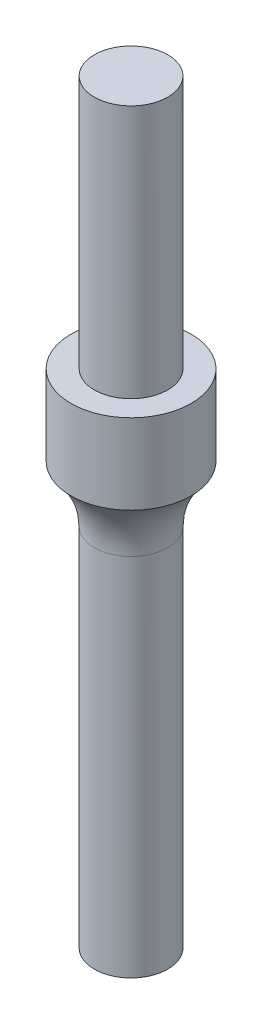
ISO-10303-21;
HEADER;
FILE_DESCRIPTION(('STEP AP214'),'2;1');
FILE_NAME('part.step','',(''),(''),'','','');
FILE_SCHEMA(('AUTOMOTIVE_DESIGN { 1 0 10303 214 1 1 1 1 }'));
ENDSEC;
DATA;
#1=APPLICATION_CONTEXT('core data for automotive mechanical design processes');
#2=APPLICATION_PROTOCOL_DEFINITION('international standard','automotive_design',2000,#1);
#3=PRODUCT_CONTEXT('',#1,'mechanical');
#4=PRODUCT('Part','Part','',(#3));
#5=PRODUCT_RELATED_PRODUCT_CATEGORY('part','',(#4));
#6=PRODUCT_DEFINITION_FORMATION('','',#4);
#7=PRODUCT_DEFINITION_CONTEXT('part definition',#1,'design');
#8=PRODUCT_DEFINITION('design','',#6,#7);
#9=PRODUCT_DEFINITION_SHAPE('','',#8);
#10=(LENGTH_UNIT() NAMED_UNIT(*) SI_UNIT(.MILLI.,.METRE.));
#11=(NAMED_UNIT(*) PLANE_ANGLE_UNIT() SI_UNIT($,.RADIAN.));
#12=(NAMED_UNIT(*) SI_UNIT($,.STERADIAN.) SOLID_ANGLE_UNIT());
#13=UNCERTAINTY_MEASURE_WITH_UNIT(LENGTH_MEASURE(1.E-05),#10,'distance_accuracy_value','');
#14=(GEOMETRIC_REPRESENTATION_CONTEXT(3) GLOBAL_UNCERTAINTY_ASSIGNED_CONTEXT((#13)) GLOBAL_UNIT_ASSIGNED_CONTEXT((#10,
#11,#12)) REPRESENTATION_CONTEXT('',''));
#15=CARTESIAN_POINT('',(0.,0.,0.));
#16=DIRECTION('',(0.,0.,1.));
#17=DIRECTION('',(1.,0.,0.));
#18=AXIS2_PLACEMENT_3D('',#15,#16,#17);
#19=CARTESIAN_POINT('',(39.00000074,-6.09116098,-25.3000002));
#20=DIRECTION('',(0.,1.,0.));
#21=DIRECTION('',(0.,0.,1.));
#22=AXIS2_PLACEMENT_3D('',#19,#20,#21);
#23=PLANE('',#22);
#24=CARTESIAN_POINT('',(39.00000074,-6.09116098,-25.3000002));
#25=DIRECTION('',(0.,-1.,0.));
#26=DIRECTION('',(0.,0.,-1.));
#27=AXIS2_PLACEMENT_3D('',#24,#25,#26);
#28=CIRCLE('',#27,1.375);
#29=CARTESIAN_POINT('',(39.00000074,-6.09116098,-26.6750002));
#30=VERTEX_POINT('',#29);
#31=EDGE_CURVE('E43',#30,#30,#28,.T.);
#32=ORIENTED_EDGE('',*,*,#31,.T.);
#33=EDGE_LOOP('',(#32));
#34=FACE_BOUND('',#33,.T.);
#35=ADVANCED_FACE('F36',(#34),#23,.F.);
#36=CARTESIAN_POINT('',(39.00000074,-6.09116098,-25.3000002));
#37=DIRECTION('',(0.,-1.,0.));
#38=DIRECTION('',(0.,0.,-1.));
#39=AXIS2_PLACEMENT_3D('',#36,#37,#38);
#40=CYLINDRICAL_SURFACE('',#39,1.375);
#41=CARTESIAN_POINT('',(39.00000074,7.58236468673782,-25.3000002));
#42=DIRECTION('',(0.,1.,0.));
#43=DIRECTION('',(0.,0.,1.));
#44=AXIS2_PLACEMENT_3D('',#41,#42,#43);
#45=CIRCLE('',#44,1.375);
#46=CARTESIAN_POINT('',(39.00000074,7.58236468673782,-23.9250002));
#47=VERTEX_POINT('',#46);
#48=EDGE_CURVE('E10',#47,#47,#45,.F.);
#49=ORIENTED_EDGE('',*,*,#48,.T.);
#50=EDGE_LOOP('',(#49));
#51=FACE_BOUND('',#50,.T.);
#52=ORIENTED_EDGE('',*,*,#31,.F.);
#53=EDGE_LOOP('',(#52));
#54=FACE_BOUND('',#53,.T.);
#55=ADVANCED_FACE('F81',(#51,#54),#40,.T.);
#56=CARTESIAN_POINT('',(39.00000074,-6.09116098,-25.3000002));
#57=DIRECTION('',(0.,-1.,0.));
#58=DIRECTION('',(0.,0.,-1.));
#59=AXIS2_PLACEMENT_3D('',#56,#57,#58);
#60=CYLINDRICAL_SURFACE('',#59,2.25);
#61=CARTESIAN_POINT('',(39.00000074,9.69999898,-25.3000002));
#62=DIRECTION('',(0.,-1.,0.));
#63=DIRECTION('',(0.,0.,-1.));
#64=AXIS2_PLACEMENT_3D('',#61,#62,#63);
#65=CIRCLE('',#64,2.25);
#66=CARTESIAN_POINT('',(39.00000074,9.69999898,-27.5500002));
#67=VERTEX_POINT('',#66);
#68=EDGE_CURVE('E47',#67,#67,#65,.T.);
#69=ORIENTED_EDGE('',*,*,#68,.F.);
#70=EDGE_LOOP('',(#69));
#71=FACE_BOUND('',#70,.T.);
#72=CARTESIAN_POINT('',(39.00000074,12.69999898,-25.3000002));
#73=DIRECTION('',(0.,-1.,0.));
#74=DIRECTION('',(0.,0.,-1.));
#75=AXIS2_PLACEMENT_3D('',#72,#73,#74);
#76=CIRCLE('',#75,2.25);
#77=CARTESIAN_POINT('',(39.00000074,12.69999898,-27.5500002));
#78=VERTEX_POINT('',#77);
#79=EDGE_CURVE('E51',#78,#78,#76,.T.);
#80=ORIENTED_EDGE('',*,*,#79,.T.);
#81=EDGE_LOOP('',(#80));
#82=FACE_BOUND('',#81,.T.);
#83=ADVANCED_FACE('F75',(#71,#82),#60,.T.);
#84=CARTESIAN_POINT('',(41.25000074,12.69999898,-25.3000002));
#85=DIRECTION('',(0.,-1.,0.));
#86=DIRECTION('',(0.,0.,-1.));
#87=AXIS2_PLACEMENT_3D('',#84,#85,#86);
#88=PLANE('',#87);
#89=ORIENTED_EDGE('',*,*,#79,.F.);
#90=EDGE_LOOP('',(#89));
#91=FACE_BOUND('',#90,.T.);
#92=CARTESIAN_POINT('',(39.00000074,12.69999898,-25.3000002));
#93=DIRECTION('',(0.,-1.,0.));
#94=DIRECTION('',(0.,0.,-1.));
#95=AXIS2_PLACEMENT_3D('',#92,#93,#94);
#96=CIRCLE('',#95,1.375);
#97=CARTESIAN_POINT('',(39.00000074,12.69999898,-26.6750002));
#98=VERTEX_POINT('',#97);
#99=EDGE_CURVE('E56',#98,#98,#96,.T.);
#100=ORIENTED_EDGE('',*,*,#99,.T.);
#101=EDGE_LOOP('',(#100));
#102=FACE_BOUND('',#101,.T.);
#103=ADVANCED_FACE('F67',(#91,#102),#88,.F.);
#104=CARTESIAN_POINT('',(39.00000074,-6.09116098,-25.3000002));
#105=DIRECTION('',(0.,-1.,0.));
#106=DIRECTION('',(0.,0.,-1.));
#107=AXIS2_PLACEMENT_3D('',#104,#105,#106);
#108=CYLINDRICAL_SURFACE('',#107,1.375);
#109=ORIENTED_EDGE('',*,*,#99,.F.);
#110=EDGE_LOOP('',(#109));
#111=FACE_BOUND('',#110,.T.);
#112=CARTESIAN_POINT('',(39.00000074,22.19999898,-25.3000002));
#113=DIRECTION('',(0.,1.,0.));
#114=DIRECTION('',(0.,0.,1.));
#115=AXIS2_PLACEMENT_3D('',#112,#113,#114);
#116=CIRCLE('',#115,1.375);
#117=CARTESIAN_POINT('',(39.00000074,22.19999898,-23.9250002));
#118=VERTEX_POINT('',#117);
#119=EDGE_CURVE('E59',#118,#118,#116,.T.);
#120=ORIENTED_EDGE('',*,*,#119,.F.);
#121=EDGE_LOOP('',(#120));
#122=FACE_BOUND('',#121,.T.);
#123=ADVANCED_FACE('F65',(#111,#122),#108,.T.);
#124=CARTESIAN_POINT('',(39.00000074,7.58236468673782,-25.3000002));
#125=DIRECTION('',(0.,1.,0.));
#126=DIRECTION('',(0.,0.,1.));
#127=AXIS2_PLACEMENT_3D('',#124,#125,#126);
#128=TOROIDAL_SURFACE('',#127,4.375,3.);
#129=ORIENTED_EDGE('',*,*,#68,.T.);
#130=EDGE_LOOP('',(#129));
#131=FACE_BOUND('',#130,.T.);
#132=ORIENTED_EDGE('',*,*,#48,.F.);
#133=EDGE_LOOP('',(#132));
#134=FACE_BOUND('',#133,.T.);
#135=ADVANCED_FACE('F38',(#131,#134),#128,.F.);
#136=CARTESIAN_POINT('',(39.00000074,22.19999898,-25.3000002));
#137=DIRECTION('',(0.,1.,0.));
#138=DIRECTION('',(0.,0.,1.));
#139=AXIS2_PLACEMENT_3D('',#136,#137,#138);
#140=PLANE('',#139);
#141=ORIENTED_EDGE('',*,*,#119,.T.);
#142=EDGE_LOOP('',(#141));
#143=FACE_BOUND('',#142,.T.);
#144=ADVANCED_FACE('F63',(#143),#140,.T.);
#145=CLOSED_SHELL('',(#35,#55,#83,#103,#123,#135,#144));
#146=MANIFOLD_SOLID_BREP('B2',#145);
#147=ADVANCED_BREP_SHAPE_REPRESENTATION('',(#18,#146),#14);
#148=SHAPE_DEFINITION_REPRESENTATION(#9,#147);
ENDSEC;
END-ISO-10303-21;
